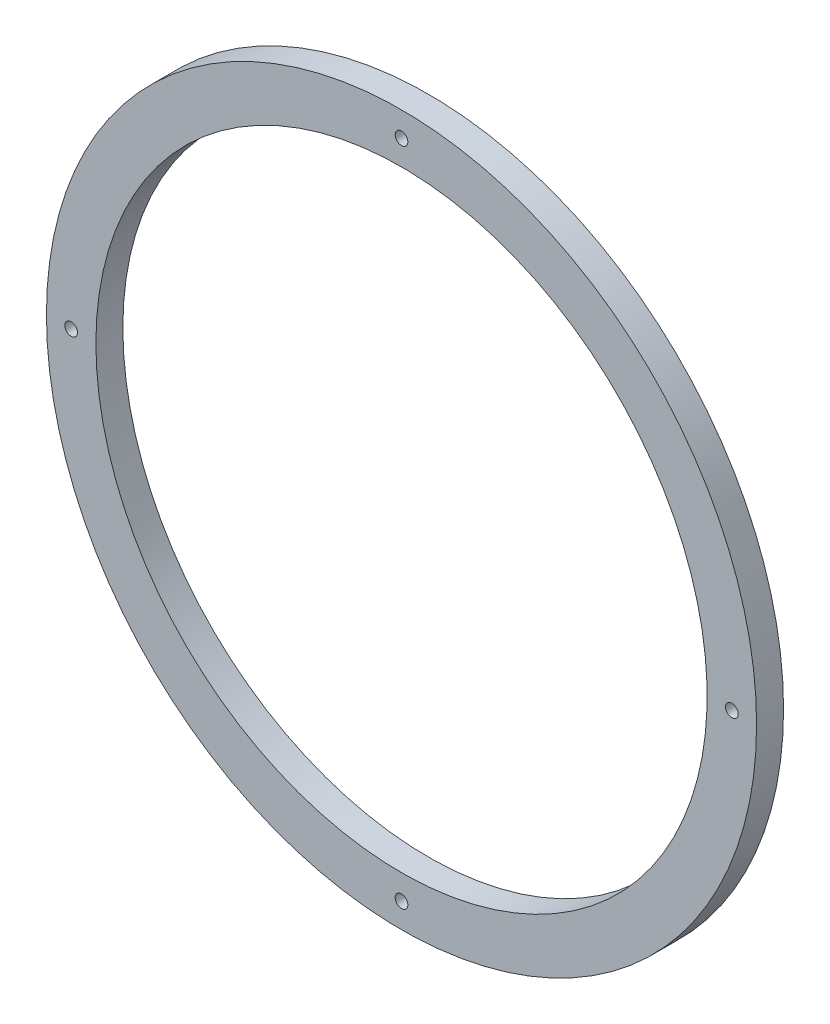
ISO-10303-21;
HEADER;
FILE_DESCRIPTION(('STEP AP214'),'2;1');
FILE_NAME('part.step','',(''),(''),'','','');
FILE_SCHEMA(('AUTOMOTIVE_DESIGN { 1 0 10303 214 1 1 1 1 }'));
ENDSEC;
DATA;
#1=APPLICATION_CONTEXT('core data for automotive mechanical design processes');
#2=APPLICATION_PROTOCOL_DEFINITION('international standard','automotive_design',2000,#1);
#3=PRODUCT_CONTEXT('',#1,'mechanical');
#4=PRODUCT('Part','Part','',(#3));
#5=PRODUCT_RELATED_PRODUCT_CATEGORY('part','',(#4));
#6=PRODUCT_DEFINITION_FORMATION('','',#4);
#7=PRODUCT_DEFINITION_CONTEXT('part definition',#1,'design');
#8=PRODUCT_DEFINITION('design','',#6,#7);
#9=PRODUCT_DEFINITION_SHAPE('','',#8);
#10=(LENGTH_UNIT() NAMED_UNIT(*) SI_UNIT(.MILLI.,.METRE.));
#11=(NAMED_UNIT(*) PLANE_ANGLE_UNIT() SI_UNIT($,.RADIAN.));
#12=(NAMED_UNIT(*) SI_UNIT($,.STERADIAN.) SOLID_ANGLE_UNIT());
#13=UNCERTAINTY_MEASURE_WITH_UNIT(LENGTH_MEASURE(1.E-05),#10,'distance_accuracy_value','');
#14=(GEOMETRIC_REPRESENTATION_CONTEXT(3) GLOBAL_UNCERTAINTY_ASSIGNED_CONTEXT((#13)) GLOBAL_UNIT_ASSIGNED_CONTEXT((#10,
#11,#12)) REPRESENTATION_CONTEXT('',''));
#15=CARTESIAN_POINT('',(0.,0.,0.));
#16=DIRECTION('',(0.,0.,1.));
#17=DIRECTION('',(1.,0.,0.));
#18=AXIS2_PLACEMENT_3D('',#15,#16,#17);
#19=CARTESIAN_POINT('',(0.,0.,7.62));
#20=DIRECTION('',(0.,0.,1.));
#21=DIRECTION('',(1.,0.,0.));
#22=AXIS2_PLACEMENT_3D('',#19,#20,#21);
#23=PLANE('',#22);
#24=CARTESIAN_POINT('',(2.67481930915103E-12,-93.3449999999974,7.62));
#25=DIRECTION('',(0.,0.,1.));
#26=DIRECTION('',(1.,0.,0.));
#27=AXIS2_PLACEMENT_3D('',#24,#25,#26);
#28=CIRCLE('',#27,1.78593750000395);
#29=CARTESIAN_POINT('',(-1.78593750000128,-93.3449999999974,7.62));
#30=VERTEX_POINT('',#29);
#31=EDGE_CURVE('E60',#30,#30,#28,.T.);
#32=ORIENTED_EDGE('',*,*,#31,.F.);
#33=EDGE_LOOP('',(#32));
#34=FACE_BOUND('',#33,.T.);
#35=CARTESIAN_POINT('',(0.,93.345,7.62));
#36=DIRECTION('',(0.,0.,1.));
#37=DIRECTION('',(1.,0.,0.));
#38=AXIS2_PLACEMENT_3D('',#35,#36,#37);
#39=CIRCLE('',#38,1.7859375);
#40=CARTESIAN_POINT('',(-1.7859375,93.345,7.62));
#41=VERTEX_POINT('',#40);
#42=EDGE_CURVE('E48',#41,#41,#39,.T.);
#43=ORIENTED_EDGE('',*,*,#42,.F.);
#44=EDGE_LOOP('',(#43));
#45=FACE_BOUND('',#44,.T.);
#46=CARTESIAN_POINT('',(0.,0.,7.62));
#47=DIRECTION('',(0.,0.,1.));
#48=DIRECTION('',(1.,0.,0.));
#49=AXIS2_PLACEMENT_3D('',#46,#47,#48);
#50=CIRCLE('',#49,100.33);
#51=CARTESIAN_POINT('',(-100.33,0.,7.62));
#52=VERTEX_POINT('',#51);
#53=EDGE_CURVE('E10',#52,#52,#50,.T.);
#54=ORIENTED_EDGE('',*,*,#53,.T.);
#55=EDGE_LOOP('',(#54));
#56=FACE_BOUND('',#55,.T.);
#57=CARTESIAN_POINT('',(0.,0.,7.62));
#58=DIRECTION('',(0.,0.,1.));
#59=DIRECTION('',(1.,0.,0.));
#60=AXIS2_PLACEMENT_3D('',#57,#58,#59);
#61=CIRCLE('',#60,86.36);
#62=CARTESIAN_POINT('',(-86.36,0.,7.62));
#63=VERTEX_POINT('',#62);
#64=EDGE_CURVE('E43',#63,#63,#61,.T.);
#65=ORIENTED_EDGE('',*,*,#64,.F.);
#66=EDGE_LOOP('',(#65));
#67=FACE_BOUND('',#66,.T.);
#68=CARTESIAN_POINT('',(93.345,2.63677968348475E-12,7.62));
#69=DIRECTION('',(0.,0.,1.));
#70=DIRECTION('',(1.,0.,0.));
#71=AXIS2_PLACEMENT_3D('',#68,#69,#70);
#72=CIRCLE('',#71,1.78593750000283);
#73=CARTESIAN_POINT('',(91.5590624999972,2.63677968348475E-12,7.62));
#74=VERTEX_POINT('',#73);
#75=EDGE_CURVE('E54',#74,#74,#72,.T.);
#76=ORIENTED_EDGE('',*,*,#75,.F.);
#77=EDGE_LOOP('',(#76));
#78=FACE_BOUND('',#77,.T.);
#79=CARTESIAN_POINT('',(-93.3449999999974,0.,7.62));
#80=DIRECTION('',(0.,0.,1.));
#81=DIRECTION('',(1.,0.,0.));
#82=AXIS2_PLACEMENT_3D('',#79,#80,#81);
#83=CIRCLE('',#82,1.78593750000172);
#84=CARTESIAN_POINT('',(-95.1309374999991,0.,7.62));
#85=VERTEX_POINT('',#84);
#86=EDGE_CURVE('E66',#85,#85,#83,.T.);
#87=ORIENTED_EDGE('',*,*,#86,.F.);
#88=EDGE_LOOP('',(#87));
#89=FACE_BOUND('',#88,.T.);
#90=ADVANCED_FACE('F32',(#34,#45,#56,#67,#78,#89),#23,.T.);
#91=CARTESIAN_POINT('',(0.,0.,0.));
#92=DIRECTION('',(0.,0.,1.));
#93=DIRECTION('',(1.,0.,0.));
#94=AXIS2_PLACEMENT_3D('',#91,#92,#93);
#95=PLANE('',#94);
#96=CARTESIAN_POINT('',(0.,0.,0.));
#97=DIRECTION('',(0.,0.,1.));
#98=DIRECTION('',(1.,0.,0.));
#99=AXIS2_PLACEMENT_3D('',#96,#97,#98);
#100=CIRCLE('',#99,100.33);
#101=CARTESIAN_POINT('',(-100.33,0.,0.));
#102=VERTEX_POINT('',#101);
#103=EDGE_CURVE('E36',#102,#102,#100,.T.);
#104=ORIENTED_EDGE('',*,*,#103,.F.);
#105=EDGE_LOOP('',(#104));
#106=FACE_BOUND('',#105,.T.);
#107=CARTESIAN_POINT('',(0.,0.,0.));
#108=DIRECTION('',(0.,0.,1.));
#109=DIRECTION('',(1.,0.,0.));
#110=AXIS2_PLACEMENT_3D('',#107,#108,#109);
#111=CIRCLE('',#110,86.36);
#112=CARTESIAN_POINT('',(-86.36,0.,0.));
#113=VERTEX_POINT('',#112);
#114=EDGE_CURVE('E45',#113,#113,#111,.T.);
#115=ORIENTED_EDGE('',*,*,#114,.T.);
#116=EDGE_LOOP('',(#115));
#117=FACE_BOUND('',#116,.T.);
#118=CARTESIAN_POINT('',(0.,93.345,0.));
#119=DIRECTION('',(0.,0.,1.));
#120=DIRECTION('',(1.,0.,0.));
#121=AXIS2_PLACEMENT_3D('',#118,#119,#120);
#122=CIRCLE('',#121,1.7859375);
#123=CARTESIAN_POINT('',(-1.7859375,93.345,0.));
#124=VERTEX_POINT('',#123);
#125=EDGE_CURVE('E51',#124,#124,#122,.T.);
#126=ORIENTED_EDGE('',*,*,#125,.T.);
#127=EDGE_LOOP('',(#126));
#128=FACE_BOUND('',#127,.T.);
#129=CARTESIAN_POINT('',(93.345,2.63677968348475E-12,0.));
#130=DIRECTION('',(0.,0.,1.));
#131=DIRECTION('',(1.,0.,0.));
#132=AXIS2_PLACEMENT_3D('',#129,#130,#131);
#133=CIRCLE('',#132,1.78593750000283);
#134=CARTESIAN_POINT('',(91.5590624999972,2.63677968348475E-12,0.));
#135=VERTEX_POINT('',#134);
#136=EDGE_CURVE('E57',#135,#135,#133,.T.);
#137=ORIENTED_EDGE('',*,*,#136,.T.);
#138=EDGE_LOOP('',(#137));
#139=FACE_BOUND('',#138,.T.);
#140=CARTESIAN_POINT('',(2.67481930915103E-12,-93.3449999999974,0.));
#141=DIRECTION('',(0.,0.,1.));
#142=DIRECTION('',(1.,0.,0.));
#143=AXIS2_PLACEMENT_3D('',#140,#141,#142);
#144=CIRCLE('',#143,1.78593750000395);
#145=CARTESIAN_POINT('',(-1.78593750000128,-93.3449999999974,0.));
#146=VERTEX_POINT('',#145);
#147=EDGE_CURVE('E63',#146,#146,#144,.T.);
#148=ORIENTED_EDGE('',*,*,#147,.T.);
#149=EDGE_LOOP('',(#148));
#150=FACE_BOUND('',#149,.T.);
#151=CARTESIAN_POINT('',(-93.3449999999974,0.,0.));
#152=DIRECTION('',(0.,0.,1.));
#153=DIRECTION('',(1.,0.,0.));
#154=AXIS2_PLACEMENT_3D('',#151,#152,#153);
#155=CIRCLE('',#154,1.78593750000172);
#156=CARTESIAN_POINT('',(-95.1309374999991,0.,0.));
#157=VERTEX_POINT('',#156);
#158=EDGE_CURVE('E69',#157,#157,#155,.T.);
#159=ORIENTED_EDGE('',*,*,#158,.T.);
#160=EDGE_LOOP('',(#159));
#161=FACE_BOUND('',#160,.T.);
#162=ADVANCED_FACE('F79',(#106,#117,#128,#139,#150,#161),#95,.F.);
#163=CARTESIAN_POINT('',(0.,0.,7.62));
#164=DIRECTION('',(0.,0.,-1.));
#165=DIRECTION('',(-1.,0.,0.));
#166=AXIS2_PLACEMENT_3D('',#163,#164,#165);
#167=CYLINDRICAL_SURFACE('',#166,100.33);
#168=CARTESIAN_POINT('',(-100.33,0.,7.62));
#169=CARTESIAN_POINT('',(-100.33,0.,7.540625));
#170=CARTESIAN_POINT('',(-100.33,0.,7.46125));
#171=CARTESIAN_POINT('',(-100.33,0.,7.3025));
#172=CARTESIAN_POINT('',(-100.33,0.,7.223125));
#173=CARTESIAN_POINT('',(-100.33,0.,7.064375));
#174=CARTESIAN_POINT('',(-100.33,0.,6.985));
#175=CARTESIAN_POINT('',(-100.33,0.,6.82625));
#176=CARTESIAN_POINT('',(-100.33,0.,6.746875));
#177=CARTESIAN_POINT('',(-100.33,0.,6.588125));
#178=CARTESIAN_POINT('',(-100.33,0.,6.50875));
#179=CARTESIAN_POINT('',(-100.33,0.,6.35));
#180=CARTESIAN_POINT('',(-100.33,0.,6.270625));
#181=CARTESIAN_POINT('',(-100.33,0.,6.111875));
#182=CARTESIAN_POINT('',(-100.33,0.,6.0325));
#183=CARTESIAN_POINT('',(-100.33,0.,5.87375));
#184=CARTESIAN_POINT('',(-100.33,0.,5.794375));
#185=CARTESIAN_POINT('',(-100.33,0.,5.635625));
#186=CARTESIAN_POINT('',(-100.33,0.,5.55625));
#187=CARTESIAN_POINT('',(-100.33,0.,5.3975));
#188=CARTESIAN_POINT('',(-100.33,0.,5.318125));
#189=CARTESIAN_POINT('',(-100.33,0.,5.159375));
#190=CARTESIAN_POINT('',(-100.33,0.,5.08));
#191=CARTESIAN_POINT('',(-100.33,0.,4.92125));
#192=CARTESIAN_POINT('',(-100.33,0.,4.841875));
#193=CARTESIAN_POINT('',(-100.33,0.,4.683125));
#194=CARTESIAN_POINT('',(-100.33,0.,4.60375));
#195=CARTESIAN_POINT('',(-100.33,0.,4.445));
#196=CARTESIAN_POINT('',(-100.33,0.,4.365625));
#197=CARTESIAN_POINT('',(-100.33,0.,4.206875));
#198=CARTESIAN_POINT('',(-100.33,0.,4.1275));
#199=CARTESIAN_POINT('',(-100.33,0.,3.96875));
#200=CARTESIAN_POINT('',(-100.33,0.,3.889375));
#201=CARTESIAN_POINT('',(-100.33,0.,3.730625));
#202=CARTESIAN_POINT('',(-100.33,0.,3.65125));
#203=CARTESIAN_POINT('',(-100.33,0.,3.4925));
#204=CARTESIAN_POINT('',(-100.33,0.,3.413125));
#205=CARTESIAN_POINT('',(-100.33,0.,3.254375));
#206=CARTESIAN_POINT('',(-100.33,0.,3.175));
#207=CARTESIAN_POINT('',(-100.33,0.,3.01625));
#208=CARTESIAN_POINT('',(-100.33,0.,2.936875));
#209=CARTESIAN_POINT('',(-100.33,0.,2.778125));
#210=CARTESIAN_POINT('',(-100.33,0.,2.69875));
#211=CARTESIAN_POINT('',(-100.33,0.,2.54));
#212=CARTESIAN_POINT('',(-100.33,0.,2.460625));
#213=CARTESIAN_POINT('',(-100.33,0.,2.301875));
#214=CARTESIAN_POINT('',(-100.33,0.,2.2225));
#215=CARTESIAN_POINT('',(-100.33,0.,2.06375));
#216=CARTESIAN_POINT('',(-100.33,0.,1.984375));
#217=CARTESIAN_POINT('',(-100.33,0.,1.825625));
#218=CARTESIAN_POINT('',(-100.33,0.,1.74625));
#219=CARTESIAN_POINT('',(-100.33,0.,1.5875));
#220=CARTESIAN_POINT('',(-100.33,0.,1.508125));
#221=CARTESIAN_POINT('',(-100.33,0.,1.349375));
#222=CARTESIAN_POINT('',(-100.33,0.,1.27));
#223=CARTESIAN_POINT('',(-100.33,0.,1.11125));
#224=CARTESIAN_POINT('',(-100.33,0.,1.031875));
#225=CARTESIAN_POINT('',(-100.33,0.,0.873125));
#226=CARTESIAN_POINT('',(-100.33,0.,0.79375));
#227=CARTESIAN_POINT('',(-100.33,0.,0.635));
#228=CARTESIAN_POINT('',(-100.33,0.,0.555625));
#229=CARTESIAN_POINT('',(-100.33,0.,0.396875));
#230=CARTESIAN_POINT('',(-100.33,0.,0.3175));
#231=CARTESIAN_POINT('',(-100.33,0.,0.15875));
#232=CARTESIAN_POINT('',(-100.33,0.,0.0793749999999999));
#233=CARTESIAN_POINT('',(-100.33,0.,0.));
#234=B_SPLINE_CURVE_WITH_KNOTS('',3,(#168,#169,#170,#171,#172,#173,#174,#175,#176,#177,#178,
#179,#180,#181,#182,#183,#184,#185,#186,#187,#188,#189,#190,#191,#192,#193,#194,#195,#196,#197,
#198,#199,#200,#201,#202,#203,#204,#205,#206,#207,#208,#209,#210,#211,#212,#213,#214,#215,#216,
#217,#218,#219,#220,#221,#222,#223,#224,#225,#226,#227,#228,#229,#230,#231,#232,#233),
.UNSPECIFIED.,.F.,.F.,(4,2,2,2,2,2,2,2,2,2,2,2,2,2,2,2,2,2,2,2,2,2,2,2,2,2,2,2,2,2,2,2,4),(0.,
0.238125,0.47625,0.714375000000001,0.9525,1.190625,1.42875,1.666875,1.905,2.143125,2.38125,
2.619375,2.8575,3.095625,3.33375,3.571875,3.81,4.048125,4.28625,4.524375,4.7625,5.000625,
5.23875,5.476875,5.715,5.953125,6.19125,6.429375,6.6675,6.905625,7.14375,7.381875,7.62),.UNSPECIFIED.);
#235=EDGE_CURVE('BSEAM34',#52,#102,#234,.T.);
#236=ORIENTED_EDGE('',*,*,#53,.F.);
#237=ORIENTED_EDGE('',*,*,#103,.T.);
#238=ORIENTED_EDGE('',*,*,#235,.T.);
#239=ORIENTED_EDGE('',*,*,#235,.F.);
#240=EDGE_LOOP('',(#236,#238,#237,#239));
#241=FACE_BOUND('',#240,.T.);
#242=ADVANCED_FACE('F34',(#241),#167,.T.);
#243=CARTESIAN_POINT('',(0.,0.,7.62));
#244=DIRECTION('',(0.,0.,-1.));
#245=DIRECTION('',(-1.,0.,0.));
#246=AXIS2_PLACEMENT_3D('',#243,#244,#245);
#247=CYLINDRICAL_SURFACE('',#246,86.36);
#248=CARTESIAN_POINT('',(-86.36,0.,7.62));
#249=CARTESIAN_POINT('',(-86.36,0.,7.540625));
#250=CARTESIAN_POINT('',(-86.36,0.,7.46125));
#251=CARTESIAN_POINT('',(-86.36,0.,7.3025));
#252=CARTESIAN_POINT('',(-86.36,0.,7.223125));
#253=CARTESIAN_POINT('',(-86.36,0.,7.064375));
#254=CARTESIAN_POINT('',(-86.36,0.,6.985));
#255=CARTESIAN_POINT('',(-86.36,0.,6.82625));
#256=CARTESIAN_POINT('',(-86.36,0.,6.746875));
#257=CARTESIAN_POINT('',(-86.36,0.,6.588125));
#258=CARTESIAN_POINT('',(-86.36,0.,6.50875));
#259=CARTESIAN_POINT('',(-86.36,0.,6.35));
#260=CARTESIAN_POINT('',(-86.36,0.,6.270625));
#261=CARTESIAN_POINT('',(-86.36,0.,6.111875));
#262=CARTESIAN_POINT('',(-86.36,0.,6.0325));
#263=CARTESIAN_POINT('',(-86.36,0.,5.87375));
#264=CARTESIAN_POINT('',(-86.36,0.,5.794375));
#265=CARTESIAN_POINT('',(-86.36,0.,5.635625));
#266=CARTESIAN_POINT('',(-86.36,0.,5.55625));
#267=CARTESIAN_POINT('',(-86.36,0.,5.3975));
#268=CARTESIAN_POINT('',(-86.36,0.,5.318125));
#269=CARTESIAN_POINT('',(-86.36,0.,5.159375));
#270=CARTESIAN_POINT('',(-86.36,0.,5.08));
#271=CARTESIAN_POINT('',(-86.36,0.,4.92125));
#272=CARTESIAN_POINT('',(-86.36,0.,4.841875));
#273=CARTESIAN_POINT('',(-86.36,0.,4.683125));
#274=CARTESIAN_POINT('',(-86.36,0.,4.60375));
#275=CARTESIAN_POINT('',(-86.36,0.,4.445));
#276=CARTESIAN_POINT('',(-86.36,0.,4.365625));
#277=CARTESIAN_POINT('',(-86.36,0.,4.206875));
#278=CARTESIAN_POINT('',(-86.36,0.,4.1275));
#279=CARTESIAN_POINT('',(-86.36,0.,3.96875));
#280=CARTESIAN_POINT('',(-86.36,0.,3.889375));
#281=CARTESIAN_POINT('',(-86.36,0.,3.730625));
#282=CARTESIAN_POINT('',(-86.36,0.,3.65125));
#283=CARTESIAN_POINT('',(-86.36,0.,3.4925));
#284=CARTESIAN_POINT('',(-86.36,0.,3.413125));
#285=CARTESIAN_POINT('',(-86.36,0.,3.254375));
#286=CARTESIAN_POINT('',(-86.36,0.,3.175));
#287=CARTESIAN_POINT('',(-86.36,0.,3.01625));
#288=CARTESIAN_POINT('',(-86.36,0.,2.936875));
#289=CARTESIAN_POINT('',(-86.36,0.,2.778125));
#290=CARTESIAN_POINT('',(-86.36,0.,2.69875));
#291=CARTESIAN_POINT('',(-86.36,0.,2.54));
#292=CARTESIAN_POINT('',(-86.36,0.,2.460625));
#293=CARTESIAN_POINT('',(-86.36,0.,2.301875));
#294=CARTESIAN_POINT('',(-86.36,0.,2.2225));
#295=CARTESIAN_POINT('',(-86.36,0.,2.06375));
#296=CARTESIAN_POINT('',(-86.36,0.,1.984375));
#297=CARTESIAN_POINT('',(-86.36,0.,1.825625));
#298=CARTESIAN_POINT('',(-86.36,0.,1.74625));
#299=CARTESIAN_POINT('',(-86.36,0.,1.5875));
#300=CARTESIAN_POINT('',(-86.36,0.,1.508125));
#301=CARTESIAN_POINT('',(-86.36,0.,1.349375));
#302=CARTESIAN_POINT('',(-86.36,0.,1.27));
#303=CARTESIAN_POINT('',(-86.36,0.,1.11125));
#304=CARTESIAN_POINT('',(-86.36,0.,1.031875));
#305=CARTESIAN_POINT('',(-86.36,0.,0.873125));
#306=CARTESIAN_POINT('',(-86.36,0.,0.79375));
#307=CARTESIAN_POINT('',(-86.36,0.,0.635));
#308=CARTESIAN_POINT('',(-86.36,0.,0.555625));
#309=CARTESIAN_POINT('',(-86.36,0.,0.396875));
#310=CARTESIAN_POINT('',(-86.36,0.,0.3175));
#311=CARTESIAN_POINT('',(-86.36,0.,0.15875));
#312=CARTESIAN_POINT('',(-86.36,0.,0.0793749999999999));
#313=CARTESIAN_POINT('',(-86.36,0.,0.));
#314=B_SPLINE_CURVE_WITH_KNOTS('',3,(#248,#249,#250,#251,#252,#253,#254,#255,#256,#257,#258,
#259,#260,#261,#262,#263,#264,#265,#266,#267,#268,#269,#270,#271,#272,#273,#274,#275,#276,#277,
#278,#279,#280,#281,#282,#283,#284,#285,#286,#287,#288,#289,#290,#291,#292,#293,#294,#295,#296,
#297,#298,#299,#300,#301,#302,#303,#304,#305,#306,#307,#308,#309,#310,#311,#312,#313),
.UNSPECIFIED.,.F.,.F.,(4,2,2,2,2,2,2,2,2,2,2,2,2,2,2,2,2,2,2,2,2,2,2,2,2,2,2,2,2,2,2,2,4),(0.,
0.238125,0.476249999999999,0.714375,0.952499999999999,1.190625,1.42875,1.666875,1.905,2.143125,
2.38125,2.619375,2.8575,3.095625,3.33375,3.571875,3.81,4.048125,4.28625,4.524375,4.7625,
5.000625,5.23875,5.476875,5.715,5.953125,6.19125,6.429375,6.6675,6.905625,7.14375,7.381875,
7.62),.UNSPECIFIED.);
#315=EDGE_CURVE('BSEAM89',#63,#113,#314,.T.);
#316=ORIENTED_EDGE('',*,*,#64,.T.);
#317=ORIENTED_EDGE('',*,*,#114,.F.);
#318=ORIENTED_EDGE('',*,*,#315,.T.);
#319=ORIENTED_EDGE('',*,*,#315,.F.);
#320=EDGE_LOOP('',(#316,#318,#317,#319));
#321=FACE_BOUND('',#320,.T.);
#322=ADVANCED_FACE('F89',(#321),#247,.F.);
#323=CARTESIAN_POINT('',(0.,93.345,7.62));
#324=DIRECTION('',(0.,0.,-1.));
#325=DIRECTION('',(-1.,0.,0.));
#326=AXIS2_PLACEMENT_3D('',#323,#324,#325);
#327=CYLINDRICAL_SURFACE('',#326,1.7859375);
#328=CARTESIAN_POINT('',(-1.7859375,93.345,7.62));
#329=CARTESIAN_POINT('',(-1.7859375,93.345,7.540625));
#330=CARTESIAN_POINT('',(-1.7859375,93.345,7.46125));
#331=CARTESIAN_POINT('',(-1.7859375,93.345,7.3025));
#332=CARTESIAN_POINT('',(-1.7859375,93.345,7.223125));
#333=CARTESIAN_POINT('',(-1.7859375,93.345,7.064375));
#334=CARTESIAN_POINT('',(-1.7859375,93.345,6.985));
#335=CARTESIAN_POINT('',(-1.7859375,93.345,6.82625));
#336=CARTESIAN_POINT('',(-1.7859375,93.345,6.746875));
#337=CARTESIAN_POINT('',(-1.7859375,93.345,6.588125));
#338=CARTESIAN_POINT('',(-1.7859375,93.345,6.50875));
#339=CARTESIAN_POINT('',(-1.7859375,93.345,6.35));
#340=CARTESIAN_POINT('',(-1.7859375,93.345,6.270625));
#341=CARTESIAN_POINT('',(-1.7859375,93.345,6.111875));
#342=CARTESIAN_POINT('',(-1.7859375,93.345,6.0325));
#343=CARTESIAN_POINT('',(-1.7859375,93.345,5.87375));
#344=CARTESIAN_POINT('',(-1.7859375,93.345,5.794375));
#345=CARTESIAN_POINT('',(-1.7859375,93.345,5.635625));
#346=CARTESIAN_POINT('',(-1.7859375,93.345,5.55625));
#347=CARTESIAN_POINT('',(-1.7859375,93.345,5.3975));
#348=CARTESIAN_POINT('',(-1.7859375,93.345,5.318125));
#349=CARTESIAN_POINT('',(-1.7859375,93.345,5.159375));
#350=CARTESIAN_POINT('',(-1.7859375,93.345,5.08));
#351=CARTESIAN_POINT('',(-1.7859375,93.345,4.92125));
#352=CARTESIAN_POINT('',(-1.7859375,93.345,4.841875));
#353=CARTESIAN_POINT('',(-1.7859375,93.345,4.683125));
#354=CARTESIAN_POINT('',(-1.7859375,93.345,4.60375));
#355=CARTESIAN_POINT('',(-1.7859375,93.345,4.445));
#356=CARTESIAN_POINT('',(-1.7859375,93.345,4.365625));
#357=CARTESIAN_POINT('',(-1.7859375,93.345,4.206875));
#358=CARTESIAN_POINT('',(-1.7859375,93.345,4.1275));
#359=CARTESIAN_POINT('',(-1.7859375,93.345,3.96875));
#360=CARTESIAN_POINT('',(-1.7859375,93.345,3.889375));
#361=CARTESIAN_POINT('',(-1.7859375,93.345,3.730625));
#362=CARTESIAN_POINT('',(-1.7859375,93.345,3.65125));
#363=CARTESIAN_POINT('',(-1.7859375,93.345,3.4925));
#364=CARTESIAN_POINT('',(-1.7859375,93.345,3.413125));
#365=CARTESIAN_POINT('',(-1.7859375,93.345,3.254375));
#366=CARTESIAN_POINT('',(-1.7859375,93.345,3.175));
#367=CARTESIAN_POINT('',(-1.7859375,93.345,3.01625));
#368=CARTESIAN_POINT('',(-1.7859375,93.345,2.936875));
#369=CARTESIAN_POINT('',(-1.7859375,93.345,2.778125));
#370=CARTESIAN_POINT('',(-1.7859375,93.345,2.69875));
#371=CARTESIAN_POINT('',(-1.7859375,93.345,2.54));
#372=CARTESIAN_POINT('',(-1.7859375,93.345,2.460625));
#373=CARTESIAN_POINT('',(-1.7859375,93.345,2.301875));
#374=CARTESIAN_POINT('',(-1.7859375,93.345,2.2225));
#375=CARTESIAN_POINT('',(-1.7859375,93.345,2.06375));
#376=CARTESIAN_POINT('',(-1.7859375,93.345,1.984375));
#377=CARTESIAN_POINT('',(-1.7859375,93.345,1.825625));
#378=CARTESIAN_POINT('',(-1.7859375,93.345,1.74625));
#379=CARTESIAN_POINT('',(-1.7859375,93.345,1.5875));
#380=CARTESIAN_POINT('',(-1.7859375,93.345,1.508125));
#381=CARTESIAN_POINT('',(-1.7859375,93.345,1.349375));
#382=CARTESIAN_POINT('',(-1.7859375,93.345,1.27));
#383=CARTESIAN_POINT('',(-1.7859375,93.345,1.11125));
#384=CARTESIAN_POINT('',(-1.7859375,93.345,1.031875));
#385=CARTESIAN_POINT('',(-1.7859375,93.345,0.873125));
#386=CARTESIAN_POINT('',(-1.7859375,93.345,0.79375));
#387=CARTESIAN_POINT('',(-1.7859375,93.345,0.635));
#388=CARTESIAN_POINT('',(-1.7859375,93.345,0.555625));
#389=CARTESIAN_POINT('',(-1.7859375,93.345,0.396875));
#390=CARTESIAN_POINT('',(-1.7859375,93.345,0.3175));
#391=CARTESIAN_POINT('',(-1.7859375,93.345,0.15875));
#392=CARTESIAN_POINT('',(-1.7859375,93.345,0.0793749999999999));
#393=CARTESIAN_POINT('',(-1.7859375,93.345,0.));
#394=B_SPLINE_CURVE_WITH_KNOTS('',3,(#328,#329,#330,#331,#332,#333,#334,#335,#336,#337,#338,
#339,#340,#341,#342,#343,#344,#345,#346,#347,#348,#349,#350,#351,#352,#353,#354,#355,#356,#357,
#358,#359,#360,#361,#362,#363,#364,#365,#366,#367,#368,#369,#370,#371,#372,#373,#374,#375,#376,
#377,#378,#379,#380,#381,#382,#383,#384,#385,#386,#387,#388,#389,#390,#391,#392,#393),
.UNSPECIFIED.,.F.,.F.,(4,2,2,2,2,2,2,2,2,2,2,2,2,2,2,2,2,2,2,2,2,2,2,2,2,2,2,2,2,2,2,2,4),(0.,
0.238125,0.47625,0.714375000000001,0.9525,1.190625,1.42875,1.666875,1.905,2.143125,2.38125,
2.619375,2.8575,3.095625,3.33375,3.571875,3.81,4.048125,4.28625,4.524375,4.7625,5.000625,
5.23875,5.476875,5.715,5.953125,6.19125,6.429375,6.6675,6.905625,7.14375,7.381875,7.62),.UNSPECIFIED.);
#395=EDGE_CURVE('BSEAM92',#41,#124,#394,.T.);
#396=ORIENTED_EDGE('',*,*,#42,.T.);
#397=ORIENTED_EDGE('',*,*,#125,.F.);
#398=ORIENTED_EDGE('',*,*,#395,.T.);
#399=ORIENTED_EDGE('',*,*,#395,.F.);
#400=EDGE_LOOP('',(#396,#398,#397,#399));
#401=FACE_BOUND('',#400,.T.);
#402=ADVANCED_FACE('F92',(#401),#327,.F.);
#403=CARTESIAN_POINT('',(93.345,2.63677968348475E-12,7.62));
#404=DIRECTION('',(0.,0.,-1.));
#405=DIRECTION('',(-1.,0.,0.));
#406=AXIS2_PLACEMENT_3D('',#403,#404,#405);
#407=CYLINDRICAL_SURFACE('',#406,1.78593750000283);
#408=CARTESIAN_POINT('',(91.5590624999972,2.63677968348475E-12,7.62));
#409=CARTESIAN_POINT('',(91.5590624999972,2.63677968348475E-12,7.540625));
#410=CARTESIAN_POINT('',(91.5590624999972,2.63677968348475E-12,7.46125));
#411=CARTESIAN_POINT('',(91.5590624999972,2.63677968348475E-12,7.3025));
#412=CARTESIAN_POINT('',(91.5590624999972,2.63677968348475E-12,7.223125));
#413=CARTESIAN_POINT('',(91.5590624999972,2.63677968348475E-12,7.064375));
#414=CARTESIAN_POINT('',(91.5590624999972,2.63677968348475E-12,6.985));
#415=CARTESIAN_POINT('',(91.5590624999972,2.63677968348475E-12,6.82625));
#416=CARTESIAN_POINT('',(91.5590624999972,2.63677968348475E-12,6.746875));
#417=CARTESIAN_POINT('',(91.5590624999972,2.63677968348475E-12,6.588125));
#418=CARTESIAN_POINT('',(91.5590624999972,2.63677968348475E-12,6.50875));
#419=CARTESIAN_POINT('',(91.5590624999972,2.63677968348475E-12,6.35));
#420=CARTESIAN_POINT('',(91.5590624999972,2.63677968348475E-12,6.270625));
#421=CARTESIAN_POINT('',(91.5590624999972,2.63677968348475E-12,6.111875));
#422=CARTESIAN_POINT('',(91.5590624999972,2.63677968348475E-12,6.0325));
#423=CARTESIAN_POINT('',(91.5590624999972,2.63677968348475E-12,5.87375));
#424=CARTESIAN_POINT('',(91.5590624999972,2.63677968348475E-12,5.794375));
#425=CARTESIAN_POINT('',(91.5590624999972,2.63677968348475E-12,5.635625));
#426=CARTESIAN_POINT('',(91.5590624999972,2.63677968348475E-12,5.55625));
#427=CARTESIAN_POINT('',(91.5590624999972,2.63677968348475E-12,5.3975));
#428=CARTESIAN_POINT('',(91.5590624999972,2.63677968348475E-12,5.318125));
#429=CARTESIAN_POINT('',(91.5590624999972,2.63677968348475E-12,5.159375));
#430=CARTESIAN_POINT('',(91.5590624999972,2.63677968348475E-12,5.08));
#431=CARTESIAN_POINT('',(91.5590624999972,2.63677968348475E-12,4.92125));
#432=CARTESIAN_POINT('',(91.5590624999972,2.63677968348475E-12,4.841875));
#433=CARTESIAN_POINT('',(91.5590624999972,2.63677968348475E-12,4.683125));
#434=CARTESIAN_POINT('',(91.5590624999972,2.63677968348475E-12,4.60375));
#435=CARTESIAN_POINT('',(91.5590624999972,2.63677968348475E-12,4.445));
#436=CARTESIAN_POINT('',(91.5590624999972,2.63677968348475E-12,4.365625));
#437=CARTESIAN_POINT('',(91.5590624999972,2.63677968348475E-12,4.206875));
#438=CARTESIAN_POINT('',(91.5590624999972,2.63677968348475E-12,4.1275));
#439=CARTESIAN_POINT('',(91.5590624999972,2.63677968348475E-12,3.96875));
#440=CARTESIAN_POINT('',(91.5590624999972,2.63677968348475E-12,3.889375));
#441=CARTESIAN_POINT('',(91.5590624999972,2.63677968348475E-12,3.730625));
#442=CARTESIAN_POINT('',(91.5590624999972,2.63677968348475E-12,3.65125));
#443=CARTESIAN_POINT('',(91.5590624999972,2.63677968348475E-12,3.4925));
#444=CARTESIAN_POINT('',(91.5590624999972,2.63677968348475E-12,3.413125));
#445=CARTESIAN_POINT('',(91.5590624999972,2.63677968348475E-12,3.254375));
#446=CARTESIAN_POINT('',(91.5590624999972,2.63677968348475E-12,3.175));
#447=CARTESIAN_POINT('',(91.5590624999972,2.63677968348475E-12,3.01625));
#448=CARTESIAN_POINT('',(91.5590624999972,2.63677968348475E-12,2.936875));
#449=CARTESIAN_POINT('',(91.5590624999972,2.63677968348475E-12,2.778125));
#450=CARTESIAN_POINT('',(91.5590624999972,2.63677968348475E-12,2.69875));
#451=CARTESIAN_POINT('',(91.5590624999972,2.63677968348475E-12,2.54));
#452=CARTESIAN_POINT('',(91.5590624999972,2.63677968348475E-12,2.460625));
#453=CARTESIAN_POINT('',(91.5590624999972,2.63677968348475E-12,2.301875));
#454=CARTESIAN_POINT('',(91.5590624999972,2.63677968348475E-12,2.2225));
#455=CARTESIAN_POINT('',(91.5590624999972,2.63677968348475E-12,2.06375));
#456=CARTESIAN_POINT('',(91.5590624999972,2.63677968348475E-12,1.984375));
#457=CARTESIAN_POINT('',(91.5590624999972,2.63677968348475E-12,1.825625));
#458=CARTESIAN_POINT('',(91.5590624999972,2.63677968348475E-12,1.74625));
#459=CARTESIAN_POINT('',(91.5590624999972,2.63677968348475E-12,1.5875));
#460=CARTESIAN_POINT('',(91.5590624999972,2.63677968348475E-12,1.508125));
#461=CARTESIAN_POINT('',(91.5590624999972,2.63677968348475E-12,1.349375));
#462=CARTESIAN_POINT('',(91.5590624999972,2.63677968348475E-12,1.27));
#463=CARTESIAN_POINT('',(91.5590624999972,2.63677968348475E-12,1.11125));
#464=CARTESIAN_POINT('',(91.5590624999972,2.63677968348475E-12,1.031875));
#465=CARTESIAN_POINT('',(91.5590624999972,2.63677968348475E-12,0.873125));
#466=CARTESIAN_POINT('',(91.5590624999972,2.63677968348475E-12,0.79375));
#467=CARTESIAN_POINT('',(91.5590624999972,2.63677968348475E-12,0.635));
#468=CARTESIAN_POINT('',(91.5590624999972,2.63677968348475E-12,0.555625));
#469=CARTESIAN_POINT('',(91.5590624999972,2.63677968348475E-12,0.396875));
#470=CARTESIAN_POINT('',(91.5590624999972,2.63677968348475E-12,0.3175));
#471=CARTESIAN_POINT('',(91.5590624999972,2.63677968348475E-12,0.15875));
#472=CARTESIAN_POINT('',(91.5590624999972,2.63677968348475E-12,0.0793749999999999));
#473=CARTESIAN_POINT('',(91.5590624999972,2.63677968348475E-12,0.));
#474=B_SPLINE_CURVE_WITH_KNOTS('',3,(#408,#409,#410,#411,#412,#413,#414,#415,#416,#417,#418,
#419,#420,#421,#422,#423,#424,#425,#426,#427,#428,#429,#430,#431,#432,#433,#434,#435,#436,#437,
#438,#439,#440,#441,#442,#443,#444,#445,#446,#447,#448,#449,#450,#451,#452,#453,#454,#455,#456,
#457,#458,#459,#460,#461,#462,#463,#464,#465,#466,#467,#468,#469,#470,#471,#472,#473),
.UNSPECIFIED.,.F.,.F.,(4,2,2,2,2,2,2,2,2,2,2,2,2,2,2,2,2,2,2,2,2,2,2,2,2,2,2,2,2,2,2,2,4),(0.,
0.238125,0.47625,0.714375000000001,0.9525,1.190625,1.42875,1.666875,1.905,2.143125,2.38125,
2.619375,2.8575,3.095625,3.33375,3.571875,3.81,4.048125,4.28625,4.524375,4.7625,5.000625,
5.23875,5.476875,5.715,5.953125,6.19125,6.429375,6.6675,6.905625,7.14375,7.381875,7.62),.UNSPECIFIED.);
#475=EDGE_CURVE('BSEAM96',#74,#135,#474,.T.);
#476=ORIENTED_EDGE('',*,*,#75,.T.);
#477=ORIENTED_EDGE('',*,*,#136,.F.);
#478=ORIENTED_EDGE('',*,*,#475,.T.);
#479=ORIENTED_EDGE('',*,*,#475,.F.);
#480=EDGE_LOOP('',(#476,#478,#477,#479));
#481=FACE_BOUND('',#480,.T.);
#482=ADVANCED_FACE('F96',(#481),#407,.F.);
#483=CARTESIAN_POINT('',(2.67481930915103E-12,-93.3449999999974,7.62));
#484=DIRECTION('',(0.,0.,-1.));
#485=DIRECTION('',(-1.,0.,0.));
#486=AXIS2_PLACEMENT_3D('',#483,#484,#485);
#487=CYLINDRICAL_SURFACE('',#486,1.78593750000395);
#488=CARTESIAN_POINT('',(-1.78593750000128,-93.3449999999974,7.62));
#489=CARTESIAN_POINT('',(-1.78593750000128,-93.3449999999974,7.540625));
#490=CARTESIAN_POINT('',(-1.78593750000128,-93.3449999999974,7.46125));
#491=CARTESIAN_POINT('',(-1.78593750000128,-93.3449999999974,7.3025));
#492=CARTESIAN_POINT('',(-1.78593750000128,-93.3449999999974,7.223125));
#493=CARTESIAN_POINT('',(-1.78593750000128,-93.3449999999974,7.064375));
#494=CARTESIAN_POINT('',(-1.78593750000128,-93.3449999999974,6.985));
#495=CARTESIAN_POINT('',(-1.78593750000128,-93.3449999999974,6.82625));
#496=CARTESIAN_POINT('',(-1.78593750000128,-93.3449999999974,6.746875));
#497=CARTESIAN_POINT('',(-1.78593750000128,-93.3449999999974,6.588125));
#498=CARTESIAN_POINT('',(-1.78593750000128,-93.3449999999974,6.50875));
#499=CARTESIAN_POINT('',(-1.78593750000128,-93.3449999999974,6.35));
#500=CARTESIAN_POINT('',(-1.78593750000128,-93.3449999999974,6.270625));
#501=CARTESIAN_POINT('',(-1.78593750000128,-93.3449999999974,6.111875));
#502=CARTESIAN_POINT('',(-1.78593750000128,-93.3449999999974,6.0325));
#503=CARTESIAN_POINT('',(-1.78593750000128,-93.3449999999974,5.87375));
#504=CARTESIAN_POINT('',(-1.78593750000128,-93.3449999999974,5.794375));
#505=CARTESIAN_POINT('',(-1.78593750000128,-93.3449999999974,5.635625));
#506=CARTESIAN_POINT('',(-1.78593750000128,-93.3449999999974,5.55625));
#507=CARTESIAN_POINT('',(-1.78593750000128,-93.3449999999974,5.3975));
#508=CARTESIAN_POINT('',(-1.78593750000128,-93.3449999999974,5.318125));
#509=CARTESIAN_POINT('',(-1.78593750000128,-93.3449999999974,5.159375));
#510=CARTESIAN_POINT('',(-1.78593750000128,-93.3449999999974,5.08));
#511=CARTESIAN_POINT('',(-1.78593750000128,-93.3449999999974,4.92125));
#512=CARTESIAN_POINT('',(-1.78593750000128,-93.3449999999974,4.841875));
#513=CARTESIAN_POINT('',(-1.78593750000128,-93.3449999999974,4.683125));
#514=CARTESIAN_POINT('',(-1.78593750000128,-93.3449999999974,4.60375));
#515=CARTESIAN_POINT('',(-1.78593750000128,-93.3449999999974,4.445));
#516=CARTESIAN_POINT('',(-1.78593750000128,-93.3449999999974,4.365625));
#517=CARTESIAN_POINT('',(-1.78593750000128,-93.3449999999974,4.206875));
#518=CARTESIAN_POINT('',(-1.78593750000128,-93.3449999999974,4.1275));
#519=CARTESIAN_POINT('',(-1.78593750000128,-93.3449999999974,3.96875));
#520=CARTESIAN_POINT('',(-1.78593750000128,-93.3449999999974,3.889375));
#521=CARTESIAN_POINT('',(-1.78593750000128,-93.3449999999974,3.730625));
#522=CARTESIAN_POINT('',(-1.78593750000128,-93.3449999999974,3.65125));
#523=CARTESIAN_POINT('',(-1.78593750000128,-93.3449999999974,3.4925));
#524=CARTESIAN_POINT('',(-1.78593750000128,-93.3449999999974,3.413125));
#525=CARTESIAN_POINT('',(-1.78593750000128,-93.3449999999974,3.254375));
#526=CARTESIAN_POINT('',(-1.78593750000128,-93.3449999999974,3.175));
#527=CARTESIAN_POINT('',(-1.78593750000128,-93.3449999999974,3.01625));
#528=CARTESIAN_POINT('',(-1.78593750000128,-93.3449999999974,2.936875));
#529=CARTESIAN_POINT('',(-1.78593750000128,-93.3449999999974,2.778125));
#530=CARTESIAN_POINT('',(-1.78593750000128,-93.3449999999974,2.69875));
#531=CARTESIAN_POINT('',(-1.78593750000128,-93.3449999999974,2.54));
#532=CARTESIAN_POINT('',(-1.78593750000128,-93.3449999999974,2.460625));
#533=CARTESIAN_POINT('',(-1.78593750000128,-93.3449999999974,2.301875));
#534=CARTESIAN_POINT('',(-1.78593750000128,-93.3449999999974,2.2225));
#535=CARTESIAN_POINT('',(-1.78593750000128,-93.3449999999974,2.06375));
#536=CARTESIAN_POINT('',(-1.78593750000128,-93.3449999999974,1.984375));
#537=CARTESIAN_POINT('',(-1.78593750000128,-93.3449999999974,1.825625));
#538=CARTESIAN_POINT('',(-1.78593750000128,-93.3449999999974,1.74625));
#539=CARTESIAN_POINT('',(-1.78593750000128,-93.3449999999974,1.5875));
#540=CARTESIAN_POINT('',(-1.78593750000128,-93.3449999999974,1.508125));
#541=CARTESIAN_POINT('',(-1.78593750000128,-93.3449999999974,1.349375));
#542=CARTESIAN_POINT('',(-1.78593750000128,-93.3449999999974,1.27));
#543=CARTESIAN_POINT('',(-1.78593750000128,-93.3449999999974,1.11125));
#544=CARTESIAN_POINT('',(-1.78593750000128,-93.3449999999974,1.031875));
#545=CARTESIAN_POINT('',(-1.78593750000128,-93.3449999999974,0.873125));
#546=CARTESIAN_POINT('',(-1.78593750000128,-93.3449999999974,0.79375));
#547=CARTESIAN_POINT('',(-1.78593750000128,-93.3449999999974,0.635));
#548=CARTESIAN_POINT('',(-1.78593750000128,-93.3449999999974,0.555625));
#549=CARTESIAN_POINT('',(-1.78593750000128,-93.3449999999974,0.396875));
#550=CARTESIAN_POINT('',(-1.78593750000128,-93.3449999999974,0.3175));
#551=CARTESIAN_POINT('',(-1.78593750000128,-93.3449999999974,0.15875));
#552=CARTESIAN_POINT('',(-1.78593750000128,-93.3449999999974,0.0793749999999999));
#553=CARTESIAN_POINT('',(-1.78593750000128,-93.3449999999974,0.));
#554=B_SPLINE_CURVE_WITH_KNOTS('',3,(#488,#489,#490,#491,#492,#493,#494,#495,#496,#497,#498,
#499,#500,#501,#502,#503,#504,#505,#506,#507,#508,#509,#510,#511,#512,#513,#514,#515,#516,#517,
#518,#519,#520,#521,#522,#523,#524,#525,#526,#527,#528,#529,#530,#531,#532,#533,#534,#535,#536,
#537,#538,#539,#540,#541,#542,#543,#544,#545,#546,#547,#548,#549,#550,#551,#552,#553),
.UNSPECIFIED.,.F.,.F.,(4,2,2,2,2,2,2,2,2,2,2,2,2,2,2,2,2,2,2,2,2,2,2,2,2,2,2,2,2,2,2,2,4),(0.,
0.238125,0.47625,0.714375000000001,0.9525,1.190625,1.42875,1.666875,1.905,2.143125,2.38125,
2.619375,2.8575,3.095625,3.33375,3.571875,3.81,4.048125,4.28625,4.524375,4.7625,5.000625,
5.23875,5.476875,5.715,5.953125,6.19125,6.429375,6.6675,6.905625,7.14375,7.381875,7.62),.UNSPECIFIED.);
#555=EDGE_CURVE('BSEAM100',#30,#146,#554,.T.);
#556=ORIENTED_EDGE('',*,*,#31,.T.);
#557=ORIENTED_EDGE('',*,*,#147,.F.);
#558=ORIENTED_EDGE('',*,*,#555,.T.);
#559=ORIENTED_EDGE('',*,*,#555,.F.);
#560=EDGE_LOOP('',(#556,#558,#557,#559));
#561=FACE_BOUND('',#560,.T.);
#562=ADVANCED_FACE('F100',(#561),#487,.F.);
#563=CARTESIAN_POINT('',(-93.3449999999974,0.,7.62));
#564=DIRECTION('',(0.,0.,-1.));
#565=DIRECTION('',(-1.,0.,0.));
#566=AXIS2_PLACEMENT_3D('',#563,#564,#565);
#567=CYLINDRICAL_SURFACE('',#566,1.78593750000172);
#568=CARTESIAN_POINT('',(-95.1309374999991,0.,7.62));
#569=CARTESIAN_POINT('',(-95.1309374999991,0.,7.540625));
#570=CARTESIAN_POINT('',(-95.1309374999991,0.,7.46125));
#571=CARTESIAN_POINT('',(-95.1309374999991,0.,7.3025));
#572=CARTESIAN_POINT('',(-95.1309374999991,0.,7.223125));
#573=CARTESIAN_POINT('',(-95.1309374999991,0.,7.064375));
#574=CARTESIAN_POINT('',(-95.1309374999991,0.,6.985));
#575=CARTESIAN_POINT('',(-95.1309374999991,0.,6.82625));
#576=CARTESIAN_POINT('',(-95.1309374999991,0.,6.746875));
#577=CARTESIAN_POINT('',(-95.1309374999991,0.,6.588125));
#578=CARTESIAN_POINT('',(-95.1309374999991,0.,6.50875));
#579=CARTESIAN_POINT('',(-95.1309374999991,0.,6.35));
#580=CARTESIAN_POINT('',(-95.1309374999991,0.,6.270625));
#581=CARTESIAN_POINT('',(-95.1309374999991,0.,6.111875));
#582=CARTESIAN_POINT('',(-95.1309374999991,0.,6.0325));
#583=CARTESIAN_POINT('',(-95.1309374999991,0.,5.87375));
#584=CARTESIAN_POINT('',(-95.1309374999991,0.,5.794375));
#585=CARTESIAN_POINT('',(-95.1309374999991,0.,5.635625));
#586=CARTESIAN_POINT('',(-95.1309374999991,0.,5.55625));
#587=CARTESIAN_POINT('',(-95.1309374999991,0.,5.3975));
#588=CARTESIAN_POINT('',(-95.1309374999991,0.,5.318125));
#589=CARTESIAN_POINT('',(-95.1309374999991,0.,5.159375));
#590=CARTESIAN_POINT('',(-95.1309374999991,0.,5.08));
#591=CARTESIAN_POINT('',(-95.1309374999991,0.,4.92125));
#592=CARTESIAN_POINT('',(-95.1309374999991,0.,4.841875));
#593=CARTESIAN_POINT('',(-95.1309374999991,0.,4.683125));
#594=CARTESIAN_POINT('',(-95.1309374999991,0.,4.60375));
#595=CARTESIAN_POINT('',(-95.1309374999991,0.,4.445));
#596=CARTESIAN_POINT('',(-95.1309374999991,0.,4.365625));
#597=CARTESIAN_POINT('',(-95.1309374999991,0.,4.206875));
#598=CARTESIAN_POINT('',(-95.1309374999991,0.,4.1275));
#599=CARTESIAN_POINT('',(-95.1309374999991,0.,3.96875));
#600=CARTESIAN_POINT('',(-95.1309374999991,0.,3.889375));
#601=CARTESIAN_POINT('',(-95.1309374999991,0.,3.730625));
#602=CARTESIAN_POINT('',(-95.1309374999991,0.,3.65125));
#603=CARTESIAN_POINT('',(-95.1309374999991,0.,3.4925));
#604=CARTESIAN_POINT('',(-95.1309374999991,0.,3.413125));
#605=CARTESIAN_POINT('',(-95.1309374999991,0.,3.254375));
#606=CARTESIAN_POINT('',(-95.1309374999991,0.,3.175));
#607=CARTESIAN_POINT('',(-95.1309374999991,0.,3.01625));
#608=CARTESIAN_POINT('',(-95.1309374999991,0.,2.936875));
#609=CARTESIAN_POINT('',(-95.1309374999991,0.,2.778125));
#610=CARTESIAN_POINT('',(-95.1309374999991,0.,2.69875));
#611=CARTESIAN_POINT('',(-95.1309374999991,0.,2.54));
#612=CARTESIAN_POINT('',(-95.1309374999991,0.,2.460625));
#613=CARTESIAN_POINT('',(-95.1309374999991,0.,2.301875));
#614=CARTESIAN_POINT('',(-95.1309374999991,0.,2.2225));
#615=CARTESIAN_POINT('',(-95.1309374999991,0.,2.06375));
#616=CARTESIAN_POINT('',(-95.1309374999991,0.,1.984375));
#617=CARTESIAN_POINT('',(-95.1309374999991,0.,1.825625));
#618=CARTESIAN_POINT('',(-95.1309374999991,0.,1.74625));
#619=CARTESIAN_POINT('',(-95.1309374999991,0.,1.5875));
#620=CARTESIAN_POINT('',(-95.1309374999991,0.,1.508125));
#621=CARTESIAN_POINT('',(-95.1309374999991,0.,1.349375));
#622=CARTESIAN_POINT('',(-95.1309374999991,0.,1.27));
#623=CARTESIAN_POINT('',(-95.1309374999991,0.,1.11125));
#624=CARTESIAN_POINT('',(-95.1309374999991,0.,1.031875));
#625=CARTESIAN_POINT('',(-95.1309374999991,0.,0.873125));
#626=CARTESIAN_POINT('',(-95.1309374999991,0.,0.79375));
#627=CARTESIAN_POINT('',(-95.1309374999991,0.,0.635));
#628=CARTESIAN_POINT('',(-95.1309374999991,0.,0.555625));
#629=CARTESIAN_POINT('',(-95.1309374999991,0.,0.396875));
#630=CARTESIAN_POINT('',(-95.1309374999991,0.,0.3175));
#631=CARTESIAN_POINT('',(-95.1309374999991,0.,0.15875));
#632=CARTESIAN_POINT('',(-95.1309374999991,0.,0.0793749999999999));
#633=CARTESIAN_POINT('',(-95.1309374999991,0.,0.));
#634=B_SPLINE_CURVE_WITH_KNOTS('',3,(#568,#569,#570,#571,#572,#573,#574,#575,#576,#577,#578,
#579,#580,#581,#582,#583,#584,#585,#586,#587,#588,#589,#590,#591,#592,#593,#594,#595,#596,#597,
#598,#599,#600,#601,#602,#603,#604,#605,#606,#607,#608,#609,#610,#611,#612,#613,#614,#615,#616,
#617,#618,#619,#620,#621,#622,#623,#624,#625,#626,#627,#628,#629,#630,#631,#632,#633),
.UNSPECIFIED.,.F.,.F.,(4,2,2,2,2,2,2,2,2,2,2,2,2,2,2,2,2,2,2,2,2,2,2,2,2,2,2,2,2,2,2,2,4),(0.,
0.238125,0.47625,0.714375000000001,0.9525,1.190625,1.42875,1.666875,1.905,2.143125,2.38125,
2.619375,2.8575,3.095625,3.33375,3.571875,3.81,4.048125,4.28625,4.524375,4.7625,5.000625,
5.23875,5.476875,5.715,5.953125,6.19125,6.429375,6.6675,6.905625,7.14375,7.381875,7.62),.UNSPECIFIED.);
#635=EDGE_CURVE('BSEAM75',#85,#157,#634,.T.);
#636=ORIENTED_EDGE('',*,*,#86,.T.);
#637=ORIENTED_EDGE('',*,*,#158,.F.);
#638=ORIENTED_EDGE('',*,*,#635,.T.);
#639=ORIENTED_EDGE('',*,*,#635,.F.);
#640=EDGE_LOOP('',(#636,#638,#637,#639));
#641=FACE_BOUND('',#640,.T.);
#642=ADVANCED_FACE('F75',(#641),#567,.F.);
#643=CLOSED_SHELL('',(#90,#162,#242,#322,#402,#482,#562,#642));
#644=MANIFOLD_SOLID_BREP('B2',#643);
#645=ADVANCED_BREP_SHAPE_REPRESENTATION('',(#18,#644),#14);
#646=SHAPE_DEFINITION_REPRESENTATION(#9,#645);
ENDSEC;
END-ISO-10303-21;
